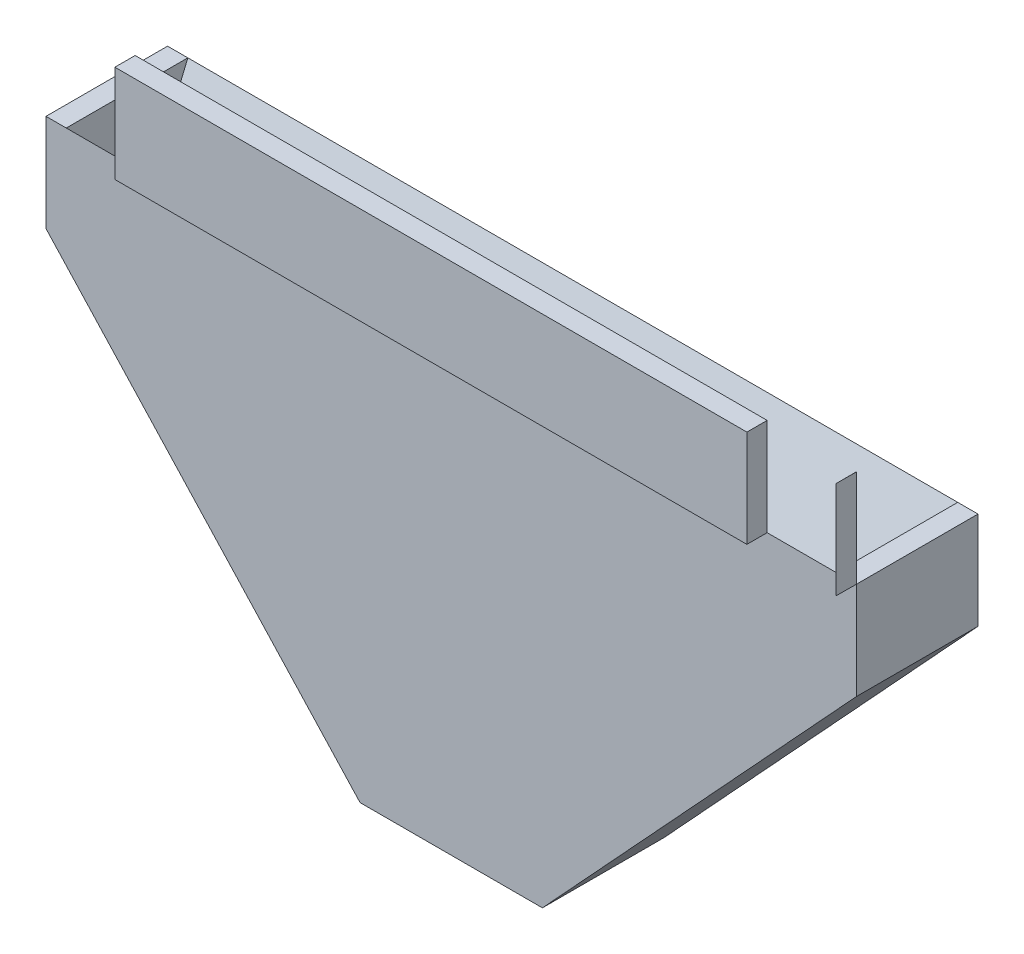
ISO-10303-21;
HEADER;
FILE_DESCRIPTION(('STEP AP214'),'2;1');
FILE_NAME('part.step','',(''),(''),'','','');
FILE_SCHEMA(('AUTOMOTIVE_DESIGN { 1 0 10303 214 1 1 1 1 }'));
ENDSEC;
DATA;
#1=APPLICATION_CONTEXT('core data for automotive mechanical design processes');
#2=APPLICATION_PROTOCOL_DEFINITION('international standard','automotive_design',2000,#1);
#3=PRODUCT_CONTEXT('',#1,'mechanical');
#4=PRODUCT('Part','Part','',(#3));
#5=PRODUCT_RELATED_PRODUCT_CATEGORY('part','',(#4));
#6=PRODUCT_DEFINITION_FORMATION('','',#4);
#7=PRODUCT_DEFINITION_CONTEXT('part definition',#1,'design');
#8=PRODUCT_DEFINITION('design','',#6,#7);
#9=PRODUCT_DEFINITION_SHAPE('','',#8);
#10=(LENGTH_UNIT() NAMED_UNIT(*) SI_UNIT(.MILLI.,.METRE.));
#11=(NAMED_UNIT(*) PLANE_ANGLE_UNIT() SI_UNIT($,.RADIAN.));
#12=(NAMED_UNIT(*) SI_UNIT($,.STERADIAN.) SOLID_ANGLE_UNIT());
#13=UNCERTAINTY_MEASURE_WITH_UNIT(LENGTH_MEASURE(1.E-05),#10,'distance_accuracy_value','');
#14=(GEOMETRIC_REPRESENTATION_CONTEXT(3) GLOBAL_UNCERTAINTY_ASSIGNED_CONTEXT((#13)) GLOBAL_UNIT_ASSIGNED_CONTEXT((#10,
#11,#12)) REPRESENTATION_CONTEXT('',''));
#15=CARTESIAN_POINT('',(0.,0.,0.));
#16=DIRECTION('',(0.,0.,1.));
#17=DIRECTION('',(1.,0.,0.));
#18=AXIS2_PLACEMENT_3D('',#15,#16,#17);
#19=CARTESIAN_POINT('',(200.,24.,30.));
#20=DIRECTION('',(0.,0.,1.));
#21=DIRECTION('',(1.,0.,0.));
#22=AXIS2_PLACEMENT_3D('',#19,#20,#21);
#23=PLANE('',#22);
#24=DIRECTION('',(-1.,0.,0.));
#25=VECTOR('',#24,1.);
#26=CARTESIAN_POINT('',(200.,0.,30.));
#27=LINE('',#26,#25);
#28=CARTESIAN_POINT('',(177.967386175276,0.,30.));
#29=VERTEX_POINT('',#28);
#30=CARTESIAN_POINT('',(22.,0.,30.));
#31=VERTEX_POINT('',#30);
#32=EDGE_CURVE('E53',#29,#31,#27,.T.);
#33=ORIENTED_EDGE('',*,*,#32,.T.);
#34=DIRECTION('',(0.,-1.,0.));
#35=VECTOR('',#34,1.);
#36=CARTESIAN_POINT('',(22.,24.,30.));
#37=LINE('',#36,#35);
#38=CARTESIAN_POINT('',(22.,24.,30.));
#39=VERTEX_POINT('',#38);
#40=EDGE_CURVE('E66',#39,#31,#37,.T.);
#41=ORIENTED_EDGE('',*,*,#40,.F.);
#42=DIRECTION('',(-1.,0.,0.));
#43=VECTOR('',#42,1.);
#44=CARTESIAN_POINT('',(200.,24.,30.));
#45=LINE('',#44,#43);
#46=CARTESIAN_POINT('',(177.967386175276,24.,30.));
#47=VERTEX_POINT('',#46);
#48=EDGE_CURVE('E97',#47,#39,#45,.T.);
#49=ORIENTED_EDGE('',*,*,#48,.F.);
#50=DIRECTION('',(0.,1.,0.));
#51=VECTOR('',#50,1.);
#52=CARTESIAN_POINT('',(177.967386175276,24.,30.));
#53=LINE('',#52,#51);
#54=EDGE_CURVE('E102',#29,#47,#53,.T.);
#55=ORIENTED_EDGE('',*,*,#54,.F.);
#56=EDGE_LOOP('',(#33,#41,#49,#55));
#57=FACE_BOUND('',#56,.T.);
#58=ADVANCED_FACE('F50',(#57),#23,.F.);
#59=CARTESIAN_POINT('',(0.,24.,35.));
#60=DIRECTION('',(0.,0.,-1.));
#61=DIRECTION('',(-1.,0.,0.));
#62=AXIS2_PLACEMENT_3D('',#59,#60,#61);
#63=PLANE('',#62);
#64=DIRECTION('',(1.,0.,0.));
#65=VECTOR('',#64,1.);
#66=CARTESIAN_POINT('',(0.,24.,35.));
#67=LINE('',#66,#65);
#68=CARTESIAN_POINT('',(22.,24.,35.));
#69=VERTEX_POINT('',#68);
#70=CARTESIAN_POINT('',(177.967386175276,24.,35.));
#71=VERTEX_POINT('',#70);
#72=EDGE_CURVE('E87',#69,#71,#67,.T.);
#73=ORIENTED_EDGE('',*,*,#72,.F.);
#74=DIRECTION('',(0.,-1.,0.));
#75=VECTOR('',#74,1.);
#76=CARTESIAN_POINT('',(22.,24.,35.));
#77=LINE('',#76,#75);
#78=CARTESIAN_POINT('',(22.,0.,35.));
#79=VERTEX_POINT('',#78);
#80=EDGE_CURVE('E109',#69,#79,#77,.T.);
#81=ORIENTED_EDGE('',*,*,#80,.T.);
#82=DIRECTION('',(1.,0.,0.));
#83=VECTOR('',#82,1.);
#84=CARTESIAN_POINT('',(0.,0.,35.));
#85=LINE('',#84,#83);
#86=CARTESIAN_POINT('',(177.967386175276,0.,35.));
#87=VERTEX_POINT('',#86);
#88=EDGE_CURVE('E98',#79,#87,#85,.T.);
#89=ORIENTED_EDGE('',*,*,#88,.T.);
#90=DIRECTION('',(0.,1.,0.));
#91=VECTOR('',#90,1.);
#92=CARTESIAN_POINT('',(177.967386175276,0.,35.));
#93=LINE('',#92,#91);
#94=EDGE_CURVE('E101',#87,#71,#93,.T.);
#95=ORIENTED_EDGE('',*,*,#94,.T.);
#96=EDGE_LOOP('',(#73,#81,#89,#95));
#97=FACE_BOUND('',#96,.T.);
#98=ADVANCED_FACE('F104',(#97),#63,.F.);
#99=CARTESIAN_POINT('',(0.,24.,0.));
#100=DIRECTION('',(0.,1.,0.));
#101=DIRECTION('',(0.,0.,1.));
#102=AXIS2_PLACEMENT_3D('',#99,#100,#101);
#103=PLANE('',#102);
#104=DIRECTION('',(0.,0.,-1.));
#105=VECTOR('',#104,1.);
#106=CARTESIAN_POINT('',(22.,24.,54.));
#107=LINE('',#106,#105);
#108=EDGE_CURVE('E93',#69,#39,#107,.T.);
#109=ORIENTED_EDGE('',*,*,#108,.F.);
#110=ORIENTED_EDGE('',*,*,#72,.T.);
#111=DIRECTION('',(0.,0.,1.));
#112=VECTOR('',#111,1.);
#113=CARTESIAN_POINT('',(177.967386175276,24.,11.));
#114=LINE('',#113,#112);
#115=EDGE_CURVE('E58',#47,#71,#114,.T.);
#116=ORIENTED_EDGE('',*,*,#115,.F.);
#117=ORIENTED_EDGE('',*,*,#48,.T.);
#118=EDGE_LOOP('',(#109,#110,#116,#117));
#119=FACE_BOUND('',#118,.T.);
#120=ADVANCED_FACE('F89',(#119),#103,.T.);
#121=CARTESIAN_POINT('',(0.,0.,0.));
#122=DIRECTION('',(0.,1.,0.));
#123=DIRECTION('',(0.,0.,1.));
#124=AXIS2_PLACEMENT_3D('',#121,#122,#123);
#125=PLANE('',#124);
#126=ORIENTED_EDGE('',*,*,#88,.F.);
#127=DIRECTION('',(0.,0.,-1.));
#128=VECTOR('',#127,1.);
#129=CARTESIAN_POINT('',(22.,0.,54.));
#130=LINE('',#129,#128);
#131=EDGE_CURVE('E114',#79,#31,#130,.T.);
#132=ORIENTED_EDGE('',*,*,#131,.T.);
#133=ORIENTED_EDGE('',*,*,#32,.F.);
#134=DIRECTION('',(0.,0.,-1.));
#135=VECTOR('',#134,1.);
#136=CARTESIAN_POINT('',(177.967386175276,0.,0.));
#137=LINE('',#136,#135);
#138=EDGE_CURVE('E12',#87,#29,#137,.T.);
#139=ORIENTED_EDGE('',*,*,#138,.F.);
#140=EDGE_LOOP('',(#126,#132,#133,#139));
#141=FACE_BOUND('',#140,.T.);
#142=ADVANCED_FACE('F119',(#141),#125,.F.);
#143=CARTESIAN_POINT('',(177.967386175276,0.,11.));
#144=DIRECTION('',(1.,0.,0.));
#145=DIRECTION('',(0.,0.,-1.));
#146=AXIS2_PLACEMENT_3D('',#143,#144,#145);
#147=PLANE('',#146);
#148=ORIENTED_EDGE('',*,*,#54,.T.);
#149=ORIENTED_EDGE('',*,*,#115,.T.);
#150=ORIENTED_EDGE('',*,*,#94,.F.);
#151=ORIENTED_EDGE('',*,*,#138,.T.);
#152=EDGE_LOOP('',(#148,#149,#150,#151));
#153=FACE_BOUND('',#152,.T.);
#154=ADVANCED_FACE('F100',(#153),#147,.T.);
#155=CARTESIAN_POINT('',(22.,24.,54.));
#156=DIRECTION('',(1.,0.,0.));
#157=DIRECTION('',(0.,1.,0.));
#158=AXIS2_PLACEMENT_3D('',#155,#156,#157);
#159=PLANE('',#158);
#160=ORIENTED_EDGE('',*,*,#108,.T.);
#161=ORIENTED_EDGE('',*,*,#40,.T.);
#162=ORIENTED_EDGE('',*,*,#131,.F.);
#163=ORIENTED_EDGE('',*,*,#80,.F.);
#164=EDGE_LOOP('',(#160,#161,#162,#163));
#165=FACE_BOUND('',#164,.T.);
#166=ADVANCED_FACE('F124',(#165),#159,.F.);
#167=CLOSED_SHELL('',(#58,#98,#120,#142,#154,#166));
#168=MANIFOLD_SOLID_BREP('B2',#167);
#169=CARTESIAN_POINT('',(0.,24.,0.));
#170=DIRECTION('',(0.,1.,0.));
#171=DIRECTION('',(0.,0.,1.));
#172=AXIS2_PLACEMENT_3D('',#169,#170,#171);
#173=PLANE('',#172);
#174=DIRECTION('',(0.,0.,1.));
#175=VECTOR('',#174,1.);
#176=CARTESIAN_POINT('',(199.967386175276,24.,11.));
#177=LINE('',#176,#175);
#178=CARTESIAN_POINT('',(199.967386175276,24.,30.));
#179=VERTEX_POINT('',#178);
#180=CARTESIAN_POINT('',(199.967386175276,24.,35.));
#181=VERTEX_POINT('',#180);
#182=EDGE_CURVE('E239',#179,#181,#177,.T.);
#183=ORIENTED_EDGE('',*,*,#182,.T.);
#184=DIRECTION('',(0.00652262618894568,0.,-0.999978727447539));
#185=VECTOR('',#184,1.);
#186=CARTESIAN_POINT('',(199.967386175276,24.,35.));
#187=LINE('',#186,#185);
#188=CARTESIAN_POINT('',(200.,24.,30.));
#189=VERTEX_POINT('',#188);
#190=EDGE_CURVE('E206',#181,#189,#187,.T.);
#191=ORIENTED_EDGE('',*,*,#190,.T.);
#192=DIRECTION('',(-1.,0.,0.));
#193=VECTOR('',#192,1.);
#194=CARTESIAN_POINT('',(200.,24.,30.));
#195=LINE('',#194,#193);
#196=EDGE_CURVE('E229',#189,#179,#195,.T.);
#197=ORIENTED_EDGE('',*,*,#196,.T.);
#198=EDGE_LOOP('',(#183,#191,#197));
#199=FACE_BOUND('',#198,.T.);
#200=ADVANCED_FACE('F183',(#199),#173,.T.);
#201=CARTESIAN_POINT('',(0.,0.,0.));
#202=DIRECTION('',(0.,1.,0.));
#203=DIRECTION('',(0.,0.,1.));
#204=AXIS2_PLACEMENT_3D('',#201,#202,#203);
#205=PLANE('',#204);
#206=DIRECTION('',(0.00652262618894568,0.,-0.999978727447539));
#207=VECTOR('',#206,1.);
#208=CARTESIAN_POINT('',(199.967386175276,0.,35.));
#209=LINE('',#208,#207);
#210=CARTESIAN_POINT('',(199.967386175276,0.,35.));
#211=VERTEX_POINT('',#210);
#212=CARTESIAN_POINT('',(200.,0.,30.));
#213=VERTEX_POINT('',#212);
#214=EDGE_CURVE('E224',#211,#213,#209,.T.);
#215=ORIENTED_EDGE('',*,*,#214,.F.);
#216=DIRECTION('',(0.,0.,-1.));
#217=VECTOR('',#216,1.);
#218=CARTESIAN_POINT('',(199.967386175276,0.,0.));
#219=LINE('',#218,#217);
#220=CARTESIAN_POINT('',(199.967386175276,0.,30.));
#221=VERTEX_POINT('',#220);
#222=EDGE_CURVE('E48',#211,#221,#219,.T.);
#223=ORIENTED_EDGE('',*,*,#222,.T.);
#224=DIRECTION('',(-1.,0.,0.));
#225=VECTOR('',#224,1.);
#226=CARTESIAN_POINT('',(200.,0.,30.));
#227=LINE('',#226,#225);
#228=EDGE_CURVE('E228',#213,#221,#227,.T.);
#229=ORIENTED_EDGE('',*,*,#228,.F.);
#230=EDGE_LOOP('',(#215,#223,#229));
#231=FACE_BOUND('',#230,.T.);
#232=ADVANCED_FACE('F227',(#231),#205,.F.);
#233=CARTESIAN_POINT('',(199.967386175276,24.,35.));
#234=DIRECTION('',(-0.999978727447539,0.,-0.00652262618894568));
#235=DIRECTION('',(-0.00652262618894568,0.,0.999978727447539));
#236=AXIS2_PLACEMENT_3D('',#233,#234,#235);
#237=PLANE('',#236);
#238=ORIENTED_EDGE('',*,*,#214,.T.);
#239=DIRECTION('',(0.,-1.,0.));
#240=VECTOR('',#239,1.);
#241=CARTESIAN_POINT('',(200.,24.,30.));
#242=LINE('',#241,#240);
#243=EDGE_CURVE('E226',#189,#213,#242,.T.);
#244=ORIENTED_EDGE('',*,*,#243,.F.);
#245=ORIENTED_EDGE('',*,*,#190,.F.);
#246=DIRECTION('',(0.,-1.,0.));
#247=VECTOR('',#246,1.);
#248=CARTESIAN_POINT('',(199.967386175276,24.,35.));
#249=LINE('',#248,#247);
#250=EDGE_CURVE('E191',#181,#211,#249,.T.);
#251=ORIENTED_EDGE('',*,*,#250,.T.);
#252=EDGE_LOOP('',(#238,#244,#245,#251));
#253=FACE_BOUND('',#252,.T.);
#254=ADVANCED_FACE('F223',(#253),#237,.F.);
#255=CARTESIAN_POINT('',(200.,24.,30.));
#256=DIRECTION('',(0.,0.,1.));
#257=DIRECTION('',(1.,0.,0.));
#258=AXIS2_PLACEMENT_3D('',#255,#256,#257);
#259=PLANE('',#258);
#260=ORIENTED_EDGE('',*,*,#228,.T.);
#261=DIRECTION('',(0.,1.,0.));
#262=VECTOR('',#261,1.);
#263=CARTESIAN_POINT('',(199.967386175276,24.,30.));
#264=LINE('',#263,#262);
#265=EDGE_CURVE('E198',#221,#179,#264,.T.);
#266=ORIENTED_EDGE('',*,*,#265,.T.);
#267=ORIENTED_EDGE('',*,*,#196,.F.);
#268=ORIENTED_EDGE('',*,*,#243,.T.);
#269=EDGE_LOOP('',(#260,#266,#267,#268));
#270=FACE_BOUND('',#269,.T.);
#271=ADVANCED_FACE('F185',(#270),#259,.F.);
#272=CARTESIAN_POINT('',(199.967386175276,0.,11.));
#273=DIRECTION('',(1.,0.,0.));
#274=DIRECTION('',(0.,0.,-1.));
#275=AXIS2_PLACEMENT_3D('',#272,#273,#274);
#276=PLANE('',#275);
#277=ORIENTED_EDGE('',*,*,#222,.F.);
#278=ORIENTED_EDGE('',*,*,#250,.F.);
#279=ORIENTED_EDGE('',*,*,#182,.F.);
#280=ORIENTED_EDGE('',*,*,#265,.F.);
#281=EDGE_LOOP('',(#277,#278,#279,#280));
#282=FACE_BOUND('',#281,.T.);
#283=ADVANCED_FACE('F217',(#282),#276,.F.);
#284=CLOSED_SHELL('',(#200,#232,#254,#271,#283));
#285=MANIFOLD_SOLID_BREP('B6',#284);
#286=CARTESIAN_POINT('',(77.5,-107.9191587474,30.));
#287=DIRECTION('',(-0.734645649323157,-0.678451007759999,0.));
#288=DIRECTION('',(0.678451007759999,-0.734645649323157,0.));
#289=AXIS2_PLACEMENT_3D('',#286,#287,#288);
#290=PLANE('',#289);
#291=DIRECTION('',(-0.678451007759999,0.734645649323157,0.));
#292=VECTOR('',#291,1.);
#293=CARTESIAN_POINT('',(77.5,-107.9191587474,0.));
#294=LINE('',#293,#292);
#295=CARTESIAN_POINT('',(77.5,-107.9191587474,0.));
#296=VERTEX_POINT('',#295);
#297=CARTESIAN_POINT('',(0.,-24.,0.));
#298=VERTEX_POINT('',#297);
#299=EDGE_CURVE('E412',#296,#298,#294,.T.);
#300=ORIENTED_EDGE('',*,*,#299,.F.);
#301=DIRECTION('',(0.,0.,-1.));
#302=VECTOR('',#301,1.);
#303=CARTESIAN_POINT('',(77.5,-107.9191587474,30.));
#304=LINE('',#303,#302);
#305=CARTESIAN_POINT('',(77.5,-107.9191587474,30.));
#306=VERTEX_POINT('',#305);
#307=EDGE_CURVE('E426',#306,#296,#304,.T.);
#308=ORIENTED_EDGE('',*,*,#307,.F.);
#309=DIRECTION('',(-0.678451007759999,0.734645649323157,0.));
#310=VECTOR('',#309,1.);
#311=CARTESIAN_POINT('',(77.5,-107.9191587474,30.));
#312=LINE('',#311,#310);
#313=CARTESIAN_POINT('',(0.,-24.,30.));
#314=VERTEX_POINT('',#313);
#315=EDGE_CURVE('E416',#306,#314,#312,.T.);
#316=ORIENTED_EDGE('',*,*,#315,.T.);
#317=DIRECTION('',(0.,0.,-1.));
#318=VECTOR('',#317,1.);
#319=CARTESIAN_POINT('',(0.,-24.,30.));
#320=LINE('',#319,#318);
#321=EDGE_CURVE('E290',#314,#298,#320,.T.);
#322=ORIENTED_EDGE('',*,*,#321,.T.);
#323=EDGE_LOOP('',(#300,#308,#316,#322));
#324=FACE_BOUND('',#323,.T.);
#325=ADVANCED_FACE('F281',(#324),#290,.T.);
#326=CARTESIAN_POINT('',(122.5,-107.9191587474,30.));
#327=DIRECTION('',(0.,-1.,0.));
#328=DIRECTION('',(0.,0.,-1.));
#329=AXIS2_PLACEMENT_3D('',#326,#327,#328);
#330=PLANE('',#329);
#331=DIRECTION('',(-1.,0.,0.));
#332=VECTOR('',#331,1.);
#333=CARTESIAN_POINT('',(0.,-107.9191587474,10.));
#334=LINE('',#333,#332);
#335=CARTESIAN_POINT('',(117.5,-107.9191587474,10.));
#336=VERTEX_POINT('',#335);
#337=CARTESIAN_POINT('',(82.5,-107.9191587474,10.));
#338=VERTEX_POINT('',#337);
#339=EDGE_CURVE('E373',#336,#338,#334,.T.);
#340=ORIENTED_EDGE('',*,*,#339,.T.);
#341=DIRECTION('',(0.,0.,-1.));
#342=VECTOR('',#341,1.);
#343=CARTESIAN_POINT('',(82.5,-107.9191587474,20.));
#344=LINE('',#343,#342);
#345=CARTESIAN_POINT('',(82.5,-107.9191587474,20.));
#346=VERTEX_POINT('',#345);
#347=EDGE_CURVE('E399',#346,#338,#344,.T.);
#348=ORIENTED_EDGE('',*,*,#347,.F.);
#349=DIRECTION('',(-1.,0.,0.));
#350=VECTOR('',#349,1.);
#351=CARTESIAN_POINT('',(0.,-107.9191587474,20.));
#352=LINE('',#351,#350);
#353=CARTESIAN_POINT('',(117.5,-107.9191587474,20.));
#354=VERTEX_POINT('',#353);
#355=EDGE_CURVE('E397',#354,#346,#352,.T.);
#356=ORIENTED_EDGE('',*,*,#355,.F.);
#357=DIRECTION('',(0.,0.,-1.));
#358=VECTOR('',#357,1.);
#359=CARTESIAN_POINT('',(117.5,-107.9191587474,20.));
#360=LINE('',#359,#358);
#361=EDGE_CURVE('E389',#354,#336,#360,.T.);
#362=ORIENTED_EDGE('',*,*,#361,.T.);
#363=EDGE_LOOP('',(#340,#348,#356,#362));
#364=FACE_BOUND('',#363,.T.);
#365=ORIENTED_EDGE('',*,*,#307,.T.);
#366=DIRECTION('',(1.,0.,0.));
#367=VECTOR('',#366,1.);
#368=CARTESIAN_POINT('',(0.,-107.9191587474,0.));
#369=LINE('',#368,#367);
#370=CARTESIAN_POINT('',(122.5,-107.9191587474,0.));
#371=VERTEX_POINT('',#370);
#372=EDGE_CURVE('E385',#296,#371,#369,.T.);
#373=ORIENTED_EDGE('',*,*,#372,.T.);
#374=DIRECTION('',(0.,0.,-1.));
#375=VECTOR('',#374,1.);
#376=CARTESIAN_POINT('',(122.5,-107.9191587474,30.));
#377=LINE('',#376,#375);
#378=CARTESIAN_POINT('',(122.5,-107.9191587474,30.));
#379=VERTEX_POINT('',#378);
#380=EDGE_CURVE('E420',#379,#371,#377,.T.);
#381=ORIENTED_EDGE('',*,*,#380,.F.);
#382=DIRECTION('',(-1.,0.,0.));
#383=VECTOR('',#382,1.);
#384=CARTESIAN_POINT('',(122.5,-107.9191587474,30.));
#385=LINE('',#384,#383);
#386=EDGE_CURVE('E411',#379,#306,#385,.T.);
#387=ORIENTED_EDGE('',*,*,#386,.T.);
#388=EDGE_LOOP('',(#365,#373,#381,#387));
#389=FACE_BOUND('',#388,.T.);
#390=ADVANCED_FACE('F395',(#364,#389),#330,.T.);
#391=CARTESIAN_POINT('',(200.,-24.,30.));
#392=DIRECTION('',(0.734645649323157,-0.678451007759998,0.));
#393=DIRECTION('',(0.678451007759998,0.734645649323157,0.));
#394=AXIS2_PLACEMENT_3D('',#391,#392,#393);
#395=PLANE('',#394);
#396=ORIENTED_EDGE('',*,*,#380,.T.);
#397=DIRECTION('',(-0.678451007759998,-0.734645649323157,0.));
#398=VECTOR('',#397,1.);
#399=CARTESIAN_POINT('',(200.,-24.,0.));
#400=LINE('',#399,#398);
#401=CARTESIAN_POINT('',(200.,-24.,0.));
#402=VERTEX_POINT('',#401);
#403=EDGE_CURVE('E403',#402,#371,#400,.T.);
#404=ORIENTED_EDGE('',*,*,#403,.F.);
#405=DIRECTION('',(0.,0.,-1.));
#406=VECTOR('',#405,1.);
#407=CARTESIAN_POINT('',(200.,-24.,30.));
#408=LINE('',#407,#406);
#409=CARTESIAN_POINT('',(200.,-24.,30.));
#410=VERTEX_POINT('',#409);
#411=EDGE_CURVE('E494',#410,#402,#408,.T.);
#412=ORIENTED_EDGE('',*,*,#411,.F.);
#413=DIRECTION('',(-0.678451007759998,-0.734645649323157,0.));
#414=VECTOR('',#413,1.);
#415=CARTESIAN_POINT('',(200.,-24.,30.));
#416=LINE('',#415,#414);
#417=EDGE_CURVE('E407',#410,#379,#416,.T.);
#418=ORIENTED_EDGE('',*,*,#417,.T.);
#419=EDGE_LOOP('',(#396,#404,#412,#418));
#420=FACE_BOUND('',#419,.T.);
#421=ADVANCED_FACE('F554',(#420),#395,.T.);
#422=CARTESIAN_POINT('',(-9.26358479676783,-8.55499307268439,20.));
#423=DIRECTION('',(-0.734645649323157,-0.678451007759998,0.));
#424=DIRECTION('',(0.678451007759998,-0.734645649323157,0.));
#425=AXIS2_PLACEMENT_3D('',#422,#423,#424);
#426=PLANE('',#425);
#427=DIRECTION('',(0.678451007759998,-0.734645649323157,0.));
#428=VECTOR('',#427,1.);
#429=CARTESIAN_POINT('',(-9.26358479676783,-8.55499307268439,10.));
#430=LINE('',#429,#428);
#431=CARTESIAN_POINT('',(5.00000000000009,-24.,10.));
#432=VERTEX_POINT('',#431);
#433=EDGE_CURVE('E379',#432,#338,#430,.T.);
#434=ORIENTED_EDGE('',*,*,#433,.F.);
#435=DIRECTION('',(0.,0.,-1.));
#436=VECTOR('',#435,1.);
#437=CARTESIAN_POINT('',(5.,-24.,0.));
#438=LINE('',#437,#436);
#439=CARTESIAN_POINT('',(5.00000000000002,-24.,20.));
#440=VERTEX_POINT('',#439);
#441=EDGE_CURVE('E444',#440,#432,#438,.T.);
#442=ORIENTED_EDGE('',*,*,#441,.F.);
#443=DIRECTION('',(-0.678451007759998,0.734645649323157,0.));
#444=VECTOR('',#443,1.);
#445=CARTESIAN_POINT('',(-9.26358479676783,-8.55499307268439,20.));
#446=LINE('',#445,#444);
#447=EDGE_CURVE('E519',#346,#440,#446,.T.);
#448=ORIENTED_EDGE('',*,*,#447,.F.);
#449=ORIENTED_EDGE('',*,*,#347,.T.);
#450=EDGE_LOOP('',(#434,#442,#448,#449));
#451=FACE_BOUND('',#450,.T.);
#452=ADVANCED_FACE('F552',(#451),#426,.F.);
#453=CARTESIAN_POINT('',(117.204430810656,-108.239209298643,20.));
#454=DIRECTION('',(0.734645649323157,-0.678451007759998,0.));
#455=DIRECTION('',(0.678451007759998,0.734645649323157,0.));
#456=AXIS2_PLACEMENT_3D('',#453,#454,#455);
#457=PLANE('',#456);
#458=DIRECTION('',(0.678451007759998,0.734645649323157,0.));
#459=VECTOR('',#458,1.);
#460=CARTESIAN_POINT('',(117.204430810656,-108.239209298643,10.));
#461=LINE('',#460,#459);
#462=CARTESIAN_POINT('',(195.,-24.,10.));
#463=VERTEX_POINT('',#462);
#464=EDGE_CURVE('E377',#336,#463,#461,.T.);
#465=ORIENTED_EDGE('',*,*,#464,.F.);
#466=ORIENTED_EDGE('',*,*,#361,.F.);
#467=DIRECTION('',(-0.678451007759998,-0.734645649323157,0.));
#468=VECTOR('',#467,1.);
#469=CARTESIAN_POINT('',(117.204430810656,-108.239209298643,20.));
#470=LINE('',#469,#468);
#471=CARTESIAN_POINT('',(195.,-24.,20.));
#472=VERTEX_POINT('',#471);
#473=EDGE_CURVE('E297',#472,#354,#470,.T.);
#474=ORIENTED_EDGE('',*,*,#473,.F.);
#475=DIRECTION('',(0.,0.,-1.));
#476=VECTOR('',#475,1.);
#477=CARTESIAN_POINT('',(195.,-24.,30.));
#478=LINE('',#477,#476);
#479=EDGE_CURVE('E392',#472,#463,#478,.T.);
#480=ORIENTED_EDGE('',*,*,#479,.T.);
#481=EDGE_LOOP('',(#465,#466,#474,#480));
#482=FACE_BOUND('',#481,.T.);
#483=ADVANCED_FACE('F388',(#482),#457,.F.);
#484=CARTESIAN_POINT('',(200.,0.,30.));
#485=DIRECTION('',(-1.,0.,0.));
#486=DIRECTION('',(0.,0.,1.));
#487=AXIS2_PLACEMENT_3D('',#484,#485,#486);
#488=PLANE('',#487);
#489=ORIENTED_EDGE('',*,*,#411,.T.);
#490=DIRECTION('',(0.,1.,0.));
#491=VECTOR('',#490,1.);
#492=CARTESIAN_POINT('',(200.,0.,0.));
#493=LINE('',#492,#491);
#494=CARTESIAN_POINT('',(200.,0.,0.));
#495=VERTEX_POINT('',#494);
#496=EDGE_CURVE('E482',#402,#495,#493,.T.);
#497=ORIENTED_EDGE('',*,*,#496,.T.);
#498=DIRECTION('',(0.,0.,1.));
#499=VECTOR('',#498,1.);
#500=CARTESIAN_POINT('',(200.,0.,0.));
#501=LINE('',#500,#499);
#502=CARTESIAN_POINT('',(200.,0.,30.));
#503=VERTEX_POINT('',#502);
#504=EDGE_CURVE('E431',#495,#503,#501,.T.);
#505=ORIENTED_EDGE('',*,*,#504,.T.);
#506=DIRECTION('',(0.,1.,0.));
#507=VECTOR('',#506,1.);
#508=CARTESIAN_POINT('',(200.,0.,30.));
#509=LINE('',#508,#507);
#510=EDGE_CURVE('E470',#410,#503,#509,.T.);
#511=ORIENTED_EDGE('',*,*,#510,.F.);
#512=EDGE_LOOP('',(#489,#497,#505,#511));
#513=FACE_BOUND('',#512,.T.);
#514=ADVANCED_FACE('F560',(#513),#488,.F.);
#515=CARTESIAN_POINT('',(0.,0.,30.));
#516=DIRECTION('',(0.,-1.,0.));
#517=DIRECTION('',(0.,0.,-1.));
#518=AXIS2_PLACEMENT_3D('',#515,#516,#517);
#519=PLANE('',#518);
#520=DIRECTION('',(0.,0.,1.));
#521=VECTOR('',#520,1.);
#522=CARTESIAN_POINT('',(5.,0.,0.));
#523=LINE('',#522,#521);
#524=CARTESIAN_POINT('',(5.,0.,0.));
#525=VERTEX_POINT('',#524);
#526=CARTESIAN_POINT('',(5.,0.,30.));
#527=VERTEX_POINT('',#526);
#528=EDGE_CURVE('E451',#525,#527,#523,.T.);
#529=ORIENTED_EDGE('',*,*,#528,.F.);
#530=DIRECTION('',(-1.,0.,0.));
#531=VECTOR('',#530,1.);
#532=CARTESIAN_POINT('',(0.,0.,0.));
#533=LINE('',#532,#531);
#534=CARTESIAN_POINT('',(0.,0.,0.));
#535=VERTEX_POINT('',#534);
#536=EDGE_CURVE('E486',#525,#535,#533,.T.);
#537=ORIENTED_EDGE('',*,*,#536,.T.);
#538=DIRECTION('',(0.,0.,-1.));
#539=VECTOR('',#538,1.);
#540=CARTESIAN_POINT('',(0.,0.,30.));
#541=LINE('',#540,#539);
#542=CARTESIAN_POINT('',(0.,0.,30.));
#543=VERTEX_POINT('',#542);
#544=EDGE_CURVE('E478',#543,#535,#541,.T.);
#545=ORIENTED_EDGE('',*,*,#544,.F.);
#546=DIRECTION('',(-1.,0.,0.));
#547=VECTOR('',#546,1.);
#548=CARTESIAN_POINT('',(0.,0.,30.));
#549=LINE('',#548,#547);
#550=EDGE_CURVE('E474',#527,#543,#549,.T.);
#551=ORIENTED_EDGE('',*,*,#550,.F.);
#552=EDGE_LOOP('',(#529,#537,#545,#551));
#553=FACE_BOUND('',#552,.T.);
#554=ADVANCED_FACE('F533',(#553),#519,.F.);
#555=CARTESIAN_POINT('',(0.,-24.,30.));
#556=DIRECTION('',(1.,0.,0.));
#557=DIRECTION('',(0.,0.,-1.));
#558=AXIS2_PLACEMENT_3D('',#555,#556,#557);
#559=PLANE('',#558);
#560=DIRECTION('',(0.,-1.,0.));
#561=VECTOR('',#560,1.);
#562=CARTESIAN_POINT('',(0.,-24.,0.));
#563=LINE('',#562,#561);
#564=EDGE_CURVE('E466',#535,#298,#563,.T.);
#565=ORIENTED_EDGE('',*,*,#564,.T.);
#566=ORIENTED_EDGE('',*,*,#321,.F.);
#567=DIRECTION('',(0.,-1.,0.));
#568=VECTOR('',#567,1.);
#569=CARTESIAN_POINT('',(0.,-24.,30.));
#570=LINE('',#569,#568);
#571=EDGE_CURVE('E467',#543,#314,#570,.T.);
#572=ORIENTED_EDGE('',*,*,#571,.F.);
#573=ORIENTED_EDGE('',*,*,#544,.T.);
#574=EDGE_LOOP('',(#565,#566,#572,#573));
#575=FACE_BOUND('',#574,.T.);
#576=ADVANCED_FACE('F283',(#575),#559,.F.);
#577=CARTESIAN_POINT('',(0.,0.,30.));
#578=DIRECTION('',(0.,0.,-1.));
#579=DIRECTION('',(-1.,0.,0.));
#580=AXIS2_PLACEMENT_3D('',#577,#578,#579);
#581=PLANE('',#580);
#582=ORIENTED_EDGE('',*,*,#571,.T.);
#583=ORIENTED_EDGE('',*,*,#315,.F.);
#584=ORIENTED_EDGE('',*,*,#386,.F.);
#585=ORIENTED_EDGE('',*,*,#417,.F.);
#586=ORIENTED_EDGE('',*,*,#510,.T.);
#587=CARTESIAN_POINT('',(195.,0.,30.));
#588=VERTEX_POINT('',#587);
#589=EDGE_CURVE('E475',#503,#588,#549,.T.);
#590=ORIENTED_EDGE('',*,*,#589,.T.);
#591=EDGE_CURVE('E305',#588,#527,#549,.T.);
#592=ORIENTED_EDGE('',*,*,#591,.T.);
#593=ORIENTED_EDGE('',*,*,#550,.T.);
#594=EDGE_LOOP('',(#582,#583,#584,#585,#586,#590,#592,#593));
#595=FACE_BOUND('',#594,.T.);
#596=ADVANCED_FACE('F537',(#595),#581,.F.);
#597=CARTESIAN_POINT('',(0.,0.,0.));
#598=DIRECTION('',(0.,0.,-1.));
#599=DIRECTION('',(-1.,0.,0.));
#600=AXIS2_PLACEMENT_3D('',#597,#598,#599);
#601=PLANE('',#600);
#602=ORIENTED_EDGE('',*,*,#372,.F.);
#603=ORIENTED_EDGE('',*,*,#299,.T.);
#604=ORIENTED_EDGE('',*,*,#564,.F.);
#605=ORIENTED_EDGE('',*,*,#536,.F.);
#606=CARTESIAN_POINT('',(195.,0.,0.));
#607=VERTEX_POINT('',#606);
#608=EDGE_CURVE('E490',#607,#525,#533,.T.);
#609=ORIENTED_EDGE('',*,*,#608,.F.);
#610=EDGE_CURVE('E471',#495,#607,#533,.T.);
#611=ORIENTED_EDGE('',*,*,#610,.F.);
#612=ORIENTED_EDGE('',*,*,#496,.F.);
#613=ORIENTED_EDGE('',*,*,#403,.T.);
#614=EDGE_LOOP('',(#602,#603,#604,#605,#609,#611,#612,#613));
#615=FACE_BOUND('',#614,.T.);
#616=ADVANCED_FACE('F509',(#615),#601,.T.);
#617=CARTESIAN_POINT('',(200.000012,-10.6508875739645,25.5621301775148));
#618=DIRECTION('',(0.,0.384615384615385,-0.923076923076923));
#619=DIRECTION('',(0.,0.923076923076923,0.384615384615385));
#620=AXIS2_PLACEMENT_3D('',#617,#618,#619);
#621=PLANE('',#620);
#622=DIRECTION('',(0.,0.923076923076923,0.384615384615385));
#623=VECTOR('',#622,1.);
#624=CARTESIAN_POINT('',(195.,-10.6508875739645,25.5621301775148));
#625=LINE('',#624,#623);
#626=EDGE_CURVE('E438',#472,#588,#625,.T.);
#627=ORIENTED_EDGE('',*,*,#626,.F.);
#628=DIRECTION('',(-1.,0.,0.));
#629=VECTOR('',#628,1.);
#630=CARTESIAN_POINT('',(200.000012,-24.,20.));
#631=LINE('',#630,#629);
#632=EDGE_CURVE('E459',#472,#440,#631,.T.);
#633=ORIENTED_EDGE('',*,*,#632,.T.);
#634=DIRECTION('',(0.,-0.923076923076923,-0.384615384615385));
#635=VECTOR('',#634,1.);
#636=CARTESIAN_POINT('',(5.,-10.6508875739645,25.5621301775148));
#637=LINE('',#636,#635);
#638=EDGE_CURVE('E455',#527,#440,#637,.T.);
#639=ORIENTED_EDGE('',*,*,#638,.F.);
#640=ORIENTED_EDGE('',*,*,#591,.F.);
#641=EDGE_LOOP('',(#627,#633,#639,#640));
#642=FACE_BOUND('',#641,.T.);
#643=ADVANCED_FACE('F526',(#642),#621,.T.);
#644=CARTESIAN_POINT('',(200.000012,0.,0.));
#645=DIRECTION('',(0.,0.384615384615385,0.923076923076923));
#646=DIRECTION('',(0.,-0.923076923076923,0.384615384615385));
#647=AXIS2_PLACEMENT_3D('',#644,#645,#646);
#648=PLANE('',#647);
#649=DIRECTION('',(0.,-0.923076923076923,0.384615384615385));
#650=VECTOR('',#649,1.);
#651=CARTESIAN_POINT('',(195.,0.,0.));
#652=LINE('',#651,#650);
#653=EDGE_CURVE('E181',#607,#463,#652,.T.);
#654=ORIENTED_EDGE('',*,*,#653,.F.);
#655=ORIENTED_EDGE('',*,*,#608,.T.);
#656=DIRECTION('',(0.,0.923076923076923,-0.384615384615385));
#657=VECTOR('',#656,1.);
#658=CARTESIAN_POINT('',(5.,0.,0.));
#659=LINE('',#658,#657);
#660=EDGE_CURVE('E447',#432,#525,#659,.T.);
#661=ORIENTED_EDGE('',*,*,#660,.F.);
#662=DIRECTION('',(-1.,0.,0.));
#663=VECTOR('',#662,1.);
#664=CARTESIAN_POINT('',(200.000012,-24.,10.));
#665=LINE('',#664,#663);
#666=EDGE_CURVE('E463',#463,#432,#665,.T.);
#667=ORIENTED_EDGE('',*,*,#666,.F.);
#668=EDGE_LOOP('',(#654,#655,#661,#667));
#669=FACE_BOUND('',#668,.T.);
#670=ADVANCED_FACE('F549',(#669),#648,.T.);
#671=CARTESIAN_POINT('',(5.,0.,0.));
#672=DIRECTION('',(1.,0.,0.));
#673=DIRECTION('',(0.,0.,-1.));
#674=AXIS2_PLACEMENT_3D('',#671,#672,#673);
#675=PLANE('',#674);
#676=ORIENTED_EDGE('',*,*,#441,.T.);
#677=ORIENTED_EDGE('',*,*,#660,.T.);
#678=ORIENTED_EDGE('',*,*,#528,.T.);
#679=ORIENTED_EDGE('',*,*,#638,.T.);
#680=EDGE_LOOP('',(#676,#677,#678,#679));
#681=FACE_BOUND('',#680,.T.);
#682=ADVANCED_FACE('F529',(#681),#675,.T.);
#683=CARTESIAN_POINT('',(195.,0.,30.));
#684=DIRECTION('',(-1.,0.,0.));
#685=DIRECTION('',(0.,-1.,0.));
#686=AXIS2_PLACEMENT_3D('',#683,#684,#685);
#687=PLANE('',#686);
#688=ORIENTED_EDGE('',*,*,#479,.F.);
#689=ORIENTED_EDGE('',*,*,#626,.T.);
#690=DIRECTION('',(0.,0.,-1.));
#691=VECTOR('',#690,1.);
#692=CARTESIAN_POINT('',(195.,0.,30.));
#693=LINE('',#692,#691);
#694=EDGE_CURVE('E435',#588,#607,#693,.T.);
#695=ORIENTED_EDGE('',*,*,#694,.T.);
#696=ORIENTED_EDGE('',*,*,#653,.T.);
#697=EDGE_LOOP('',(#688,#689,#695,#696));
#698=FACE_BOUND('',#697,.T.);
#699=ADVANCED_FACE('F543',(#698),#687,.T.);
#700=CARTESIAN_POINT('',(0.,0.,0.));
#701=DIRECTION('',(0.,-1.,0.));
#702=DIRECTION('',(0.,0.,-1.));
#703=AXIS2_PLACEMENT_3D('',#700,#701,#702);
#704=PLANE('',#703);
#705=ORIENTED_EDGE('',*,*,#504,.F.);
#706=ORIENTED_EDGE('',*,*,#610,.T.);
#707=ORIENTED_EDGE('',*,*,#694,.F.);
#708=ORIENTED_EDGE('',*,*,#589,.F.);
#709=EDGE_LOOP('',(#705,#706,#707,#708));
#710=FACE_BOUND('',#709,.T.);
#711=ADVANCED_FACE('F544',(#710),#704,.F.);
#712=CARTESIAN_POINT('',(0.,0.,20.));
#713=DIRECTION('',(0.,0.,-1.));
#714=DIRECTION('',(-1.,0.,0.));
#715=AXIS2_PLACEMENT_3D('',#712,#713,#714);
#716=PLANE('',#715);
#717=ORIENTED_EDGE('',*,*,#447,.T.);
#718=ORIENTED_EDGE('',*,*,#632,.F.);
#719=ORIENTED_EDGE('',*,*,#473,.T.);
#720=ORIENTED_EDGE('',*,*,#355,.T.);
#721=EDGE_LOOP('',(#717,#718,#719,#720));
#722=FACE_BOUND('',#721,.T.);
#723=ADVANCED_FACE('F524',(#722),#716,.T.);
#724=CARTESIAN_POINT('',(195.,-108.,10.));
#725=DIRECTION('',(0.,0.,-1.));
#726=DIRECTION('',(-1.,0.,0.));
#727=AXIS2_PLACEMENT_3D('',#724,#725,#726);
#728=PLANE('',#727);
#729=ORIENTED_EDGE('',*,*,#433,.T.);
#730=ORIENTED_EDGE('',*,*,#339,.F.);
#731=ORIENTED_EDGE('',*,*,#464,.T.);
#732=ORIENTED_EDGE('',*,*,#666,.T.);
#733=EDGE_LOOP('',(#729,#730,#731,#732));
#734=FACE_BOUND('',#733,.T.);
#735=ADVANCED_FACE('F375',(#734),#728,.F.);
#736=CLOSED_SHELL('',(#325,#390,#421,#452,#483,#514,#554,#576,#596,#616,#643,#670,#682,#699,
#711,#723,#735));
#737=MANIFOLD_SOLID_BREP('B42',#736);
#738=ADVANCED_BREP_SHAPE_REPRESENTATION('',(#18,#168,#285,#737),#14);
#739=SHAPE_DEFINITION_REPRESENTATION(#9,#738);
ENDSEC;
END-ISO-10303-21;
